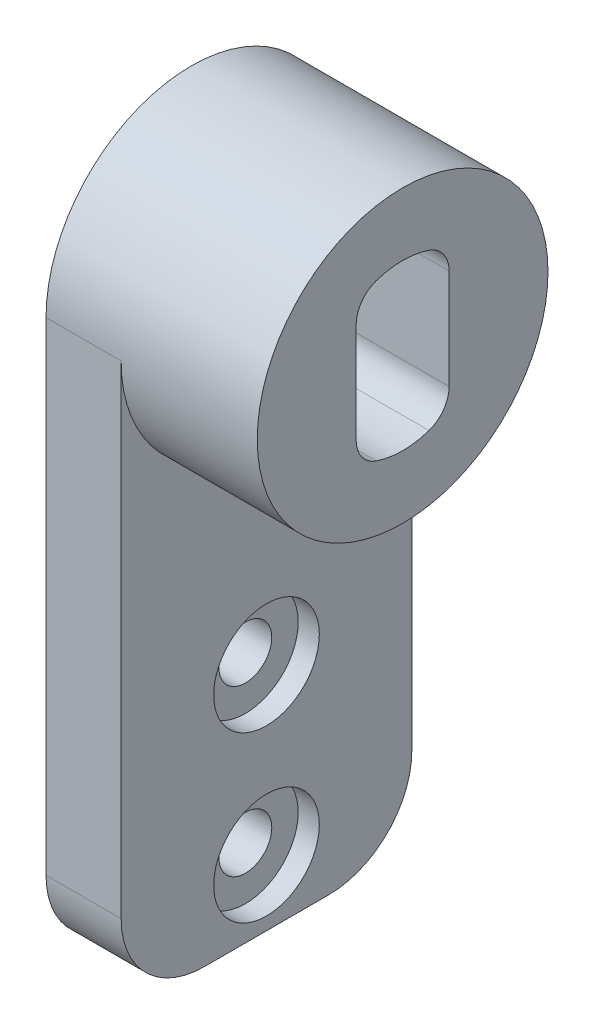
ISO-10303-21;
HEADER;
FILE_DESCRIPTION(('STEP AP214'),'2;1');
FILE_NAME('part.step','',(''),(''),'','','');
FILE_SCHEMA(('AUTOMOTIVE_DESIGN { 1 0 10303 214 1 1 1 1 }'));
ENDSEC;
DATA;
#1=APPLICATION_CONTEXT('core data for automotive mechanical design processes');
#2=APPLICATION_PROTOCOL_DEFINITION('international standard','automotive_design',2000,#1);
#3=PRODUCT_CONTEXT('',#1,'mechanical');
#4=PRODUCT('Part','Part','',(#3));
#5=PRODUCT_RELATED_PRODUCT_CATEGORY('part','',(#4));
#6=PRODUCT_DEFINITION_FORMATION('','',#4);
#7=PRODUCT_DEFINITION_CONTEXT('part definition',#1,'design');
#8=PRODUCT_DEFINITION('design','',#6,#7);
#9=PRODUCT_DEFINITION_SHAPE('','',#8);
#10=(LENGTH_UNIT() NAMED_UNIT(*) SI_UNIT(.MILLI.,.METRE.));
#11=(NAMED_UNIT(*) PLANE_ANGLE_UNIT() SI_UNIT($,.RADIAN.));
#12=(NAMED_UNIT(*) SI_UNIT($,.STERADIAN.) SOLID_ANGLE_UNIT());
#13=UNCERTAINTY_MEASURE_WITH_UNIT(LENGTH_MEASURE(1.E-05),#10,'distance_accuracy_value','');
#14=(GEOMETRIC_REPRESENTATION_CONTEXT(3) GLOBAL_UNCERTAINTY_ASSIGNED_CONTEXT((#13)) GLOBAL_UNIT_ASSIGNED_CONTEXT((#10,
#11,#12)) REPRESENTATION_CONTEXT('',''));
#15=CARTESIAN_POINT('',(0.,0.,0.));
#16=DIRECTION('',(0.,0.,1.));
#17=DIRECTION('',(1.,0.,0.));
#18=AXIS2_PLACEMENT_3D('',#15,#16,#17);
#19=CARTESIAN_POINT('',(12.7,-30.0897103576115,0.));
#20=DIRECTION('',(-1.,0.,0.));
#21=DIRECTION('',(0.,0.,1.));
#22=AXIS2_PLACEMENT_3D('',#19,#20,#21);
#23=CYLINDRICAL_SURFACE('',#22,1.5875);
#24=CARTESIAN_POINT('',(0.,-30.0897103576115,0.));
#25=DIRECTION('',(-1.,0.,0.));
#26=DIRECTION('',(0.,0.,1.));
#27=AXIS2_PLACEMENT_3D('',#24,#25,#26);
#28=CIRCLE('',#27,1.5875);
#29=CARTESIAN_POINT('',(0.,-30.0897103576115,1.5875));
#30=VERTEX_POINT('',#29);
#31=EDGE_CURVE('E220',#30,#30,#28,.T.);
#32=ORIENTED_EDGE('',*,*,#31,.T.);
#33=EDGE_LOOP('',(#32));
#34=FACE_BOUND('',#33,.T.);
#35=CARTESIAN_POINT('',(3.246000112,-30.0897103576115,0.));
#36=DIRECTION('',(1.,0.,0.));
#37=DIRECTION('',(0.,0.,-1.));
#38=AXIS2_PLACEMENT_3D('',#35,#36,#37);
#39=CIRCLE('',#38,1.5875);
#40=CARTESIAN_POINT('',(3.246000112,-30.0897103576115,-1.5875));
#41=VERTEX_POINT('',#40);
#42=EDGE_CURVE('E216',#41,#41,#39,.F.);
#43=ORIENTED_EDGE('',*,*,#42,.F.);
#44=EDGE_LOOP('',(#43));
#45=FACE_BOUND('',#44,.T.);
#46=ADVANCED_FACE('F49',(#34,#45),#23,.F.);
#47=CARTESIAN_POINT('',(12.7,-20.1843484056115,0.));
#48=DIRECTION('',(-1.,0.,0.));
#49=DIRECTION('',(0.,0.,1.));
#50=AXIS2_PLACEMENT_3D('',#47,#48,#49);
#51=CYLINDRICAL_SURFACE('',#50,1.5875);
#52=CARTESIAN_POINT('',(0.,-20.1843484056115,0.));
#53=DIRECTION('',(-1.,0.,0.));
#54=DIRECTION('',(0.,0.,1.));
#55=AXIS2_PLACEMENT_3D('',#52,#53,#54);
#56=CIRCLE('',#55,1.5875);
#57=CARTESIAN_POINT('',(0.,-20.1843484056115,1.5875));
#58=VERTEX_POINT('',#57);
#59=EDGE_CURVE('E283',#58,#58,#56,.T.);
#60=ORIENTED_EDGE('',*,*,#59,.T.);
#61=EDGE_LOOP('',(#60));
#62=FACE_BOUND('',#61,.T.);
#63=CARTESIAN_POINT('',(3.246000112,-20.1843484056115,0.));
#64=DIRECTION('',(1.,0.,0.));
#65=DIRECTION('',(0.,0.,-1.));
#66=AXIS2_PLACEMENT_3D('',#63,#64,#65);
#67=CIRCLE('',#66,1.5875);
#68=CARTESIAN_POINT('',(3.246000112,-20.1843484056115,-1.5875));
#69=VERTEX_POINT('',#68);
#70=EDGE_CURVE('E580',#69,#69,#67,.T.);
#71=ORIENTED_EDGE('',*,*,#70,.T.);
#72=EDGE_LOOP('',(#71));
#73=FACE_BOUND('',#72,.T.);
#74=ADVANCED_FACE('F362',(#62,#73),#51,.F.);
#75=CARTESIAN_POINT('',(12.7,0.,0.));
#76=DIRECTION('',(-1.,0.,0.));
#77=DIRECTION('',(0.,0.,1.));
#78=AXIS2_PLACEMENT_3D('',#75,#76,#77);
#79=CYLINDRICAL_SURFACE('',#78,8.7376);
#80=CARTESIAN_POINT('',(4.516000112,0.,0.));
#81=DIRECTION('',(-1.,0.,0.));
#82=DIRECTION('',(0.,0.,1.));
#83=AXIS2_PLACEMENT_3D('',#80,#81,#82);
#84=CIRCLE('',#83,8.7376);
#85=CARTESIAN_POINT('',(4.516000112,0.,-8.7376));
#86=VERTEX_POINT('',#85);
#87=CARTESIAN_POINT('',(4.516000112,0.,8.7376));
#88=VERTEX_POINT('',#87);
#89=EDGE_CURVE('E179',#86,#88,#84,.T.);
#90=ORIENTED_EDGE('',*,*,#89,.F.);
#91=DIRECTION('',(-1.,0.,0.));
#92=VECTOR('',#91,1.);
#93=CARTESIAN_POINT('',(4.516000112,0.,-8.7376));
#94=LINE('',#93,#92);
#95=CARTESIAN_POINT('',(0.,0.,-8.7376));
#96=VERTEX_POINT('',#95);
#97=EDGE_CURVE('E156',#86,#96,#94,.T.);
#98=ORIENTED_EDGE('',*,*,#97,.T.);
#99=CARTESIAN_POINT('',(0.,0.,0.));
#100=DIRECTION('',(1.,0.,0.));
#101=DIRECTION('',(0.,0.,-1.));
#102=AXIS2_PLACEMENT_3D('',#99,#100,#101);
#103=CIRCLE('',#102,8.7376);
#104=CARTESIAN_POINT('',(0.,0.,8.7376));
#105=VERTEX_POINT('',#104);
#106=EDGE_CURVE('E165',#96,#105,#103,.T.);
#107=ORIENTED_EDGE('',*,*,#106,.T.);
#108=DIRECTION('',(-1.,0.,0.));
#109=VECTOR('',#108,1.);
#110=CARTESIAN_POINT('',(4.516000112,0.,8.7376));
#111=LINE('',#110,#109);
#112=EDGE_CURVE('E181',#88,#105,#111,.T.);
#113=ORIENTED_EDGE('',*,*,#112,.F.);
#114=EDGE_LOOP('',(#90,#98,#107,#113));
#115=FACE_BOUND('',#114,.T.);
#116=CARTESIAN_POINT('',(12.7,0.,0.));
#117=DIRECTION('',(1.,0.,0.));
#118=DIRECTION('',(0.,0.,-1.));
#119=AXIS2_PLACEMENT_3D('',#116,#117,#118);
#120=CIRCLE('',#119,8.7376);
#121=CARTESIAN_POINT('',(12.7,0.,-8.7376));
#122=VERTEX_POINT('',#121);
#123=EDGE_CURVE('E173',#122,#122,#120,.T.);
#124=ORIENTED_EDGE('',*,*,#123,.F.);
#125=EDGE_LOOP('',(#124));
#126=FACE_BOUND('',#125,.T.);
#127=ADVANCED_FACE('F176',(#115,#126),#79,.T.);
#128=CARTESIAN_POINT('',(12.7,0.,0.));
#129=DIRECTION('',(1.,0.,0.));
#130=DIRECTION('',(0.,0.,-1.));
#131=AXIS2_PLACEMENT_3D('',#128,#129,#130);
#132=PLANE('',#131);
#133=CARTESIAN_POINT('',(12.7,0.,0.));
#134=DIRECTION('',(1.,0.,0.));
#135=DIRECTION('',(0.,0.,-1.));
#136=AXIS2_PLACEMENT_3D('',#133,#134,#135);
#137=CIRCLE('',#136,4.953);
#138=CARTESIAN_POINT('',(12.7,4.69255908842926,-1.58496));
#139=VERTEX_POINT('',#138);
#140=CARTESIAN_POINT('',(12.7,4.69255908842926,1.58496));
#141=VERTEX_POINT('',#140);
#142=EDGE_CURVE('E271',#139,#141,#137,.T.);
#143=ORIENTED_EDGE('',*,*,#142,.F.);
#144=CARTESIAN_POINT('',(12.7,3.00805069771106,-1.016));
#145=DIRECTION('',(1.,0.,0.));
#146=DIRECTION('',(0.,0.,-1.));
#147=AXIS2_PLACEMENT_3D('',#144,#145,#146);
#148=CIRCLE('',#147,1.778);
#149=CARTESIAN_POINT('',(12.7,3.00805069771106,-2.794));
#150=VERTEX_POINT('',#149);
#151=EDGE_CURVE('E260',#139,#150,#148,.F.);
#152=ORIENTED_EDGE('',*,*,#151,.T.);
#153=DIRECTION('',(0.,1.,0.));
#154=VECTOR('',#153,1.);
#155=CARTESIAN_POINT('',(12.7,-4.08971551577857,-2.794));
#156=LINE('',#155,#154);
#157=CARTESIAN_POINT('',(12.7,-3.00805069771106,-2.794));
#158=VERTEX_POINT('',#157);
#159=EDGE_CURVE('E304',#158,#150,#156,.T.);
#160=ORIENTED_EDGE('',*,*,#159,.F.);
#161=CARTESIAN_POINT('',(12.7,-3.00805069771106,-1.016));
#162=DIRECTION('',(1.,0.,0.));
#163=DIRECTION('',(0.,0.,-1.));
#164=AXIS2_PLACEMENT_3D('',#161,#162,#163);
#165=CIRCLE('',#164,1.778);
#166=CARTESIAN_POINT('',(12.7,-4.69255908842926,-1.58496));
#167=VERTEX_POINT('',#166);
#168=EDGE_CURVE('E58',#158,#167,#165,.F.);
#169=ORIENTED_EDGE('',*,*,#168,.T.);
#170=CARTESIAN_POINT('',(12.7,0.,0.));
#171=DIRECTION('',(1.,0.,0.));
#172=DIRECTION('',(0.,0.,-1.));
#173=AXIS2_PLACEMENT_3D('',#170,#171,#172);
#174=CIRCLE('',#173,4.953);
#175=CARTESIAN_POINT('',(12.7,-4.69255908842926,1.58496));
#176=VERTEX_POINT('',#175);
#177=EDGE_CURVE('E312',#176,#167,#174,.T.);
#178=ORIENTED_EDGE('',*,*,#177,.F.);
#179=CARTESIAN_POINT('',(12.7,-3.00805069771106,1.016));
#180=DIRECTION('',(1.,0.,0.));
#181=DIRECTION('',(0.,0.,-1.));
#182=AXIS2_PLACEMENT_3D('',#179,#180,#181);
#183=CIRCLE('',#182,1.778);
#184=CARTESIAN_POINT('',(12.7,-3.00805069771106,2.794));
#185=VERTEX_POINT('',#184);
#186=EDGE_CURVE('E11',#176,#185,#183,.F.);
#187=ORIENTED_EDGE('',*,*,#186,.T.);
#188=DIRECTION('',(0.,-1.,0.));
#189=VECTOR('',#188,1.);
#190=CARTESIAN_POINT('',(12.7,-4.08971551577857,2.794));
#191=LINE('',#190,#189);
#192=CARTESIAN_POINT('',(12.7,3.00805069771106,2.794));
#193=VERTEX_POINT('',#192);
#194=EDGE_CURVE('E273',#193,#185,#191,.T.);
#195=ORIENTED_EDGE('',*,*,#194,.F.);
#196=CARTESIAN_POINT('',(12.7,3.00805069771106,1.016));
#197=DIRECTION('',(1.,0.,0.));
#198=DIRECTION('',(0.,0.,-1.));
#199=AXIS2_PLACEMENT_3D('',#196,#197,#198);
#200=CIRCLE('',#199,1.778);
#201=EDGE_CURVE('E263',#193,#141,#200,.F.);
#202=ORIENTED_EDGE('',*,*,#201,.T.);
#203=EDGE_LOOP('',(#143,#152,#160,#169,#178,#187,#195,#202));
#204=FACE_BOUND('',#203,.T.);
#205=ORIENTED_EDGE('',*,*,#123,.T.);
#206=EDGE_LOOP('',(#205));
#207=FACE_BOUND('',#206,.T.);
#208=ADVANCED_FACE('F269',(#204,#207),#132,.T.);
#209=CARTESIAN_POINT('',(0.,0.,0.));
#210=DIRECTION('',(1.,0.,0.));
#211=DIRECTION('',(0.,0.,-1.));
#212=AXIS2_PLACEMENT_3D('',#209,#210,#211);
#213=PLANE('',#212);
#214=ORIENTED_EDGE('',*,*,#59,.F.);
#215=EDGE_LOOP('',(#214));
#216=FACE_BOUND('',#215,.T.);
#217=ORIENTED_EDGE('',*,*,#31,.F.);
#218=EDGE_LOOP('',(#217));
#219=FACE_BOUND('',#218,.T.);
#220=DIRECTION('',(0.,0.,-1.));
#221=VECTOR('',#220,1.);
#222=CARTESIAN_POINT('',(0.,-34.036,0.));
#223=LINE('',#222,#221);
#224=CARTESIAN_POINT('',(0.,-34.036,3.7376));
#225=VERTEX_POINT('',#224);
#226=CARTESIAN_POINT('',(0.,-34.036,-3.7376));
#227=VERTEX_POINT('',#226);
#228=EDGE_CURVE('E161',#225,#227,#223,.T.);
#229=ORIENTED_EDGE('',*,*,#228,.F.);
#230=CARTESIAN_POINT('',(0.,-29.036,3.7376));
#231=DIRECTION('',(1.,0.,0.));
#232=DIRECTION('',(0.,0.,-1.));
#233=AXIS2_PLACEMENT_3D('',#230,#231,#232);
#234=CIRCLE('',#233,5.);
#235=CARTESIAN_POINT('',(0.,-29.036,8.7376));
#236=VERTEX_POINT('',#235);
#237=EDGE_CURVE('E201',#225,#236,#234,.F.);
#238=ORIENTED_EDGE('',*,*,#237,.T.);
#239=DIRECTION('',(0.,-1.,0.));
#240=VECTOR('',#239,1.);
#241=CARTESIAN_POINT('',(0.,0.,8.7376));
#242=LINE('',#241,#240);
#243=EDGE_CURVE('E169',#105,#236,#242,.T.);
#244=ORIENTED_EDGE('',*,*,#243,.F.);
#245=ORIENTED_EDGE('',*,*,#106,.F.);
#246=DIRECTION('',(0.,1.,0.));
#247=VECTOR('',#246,1.);
#248=CARTESIAN_POINT('',(0.,0.,-8.7376));
#249=LINE('',#248,#247);
#250=CARTESIAN_POINT('',(0.,-29.036,-8.7376));
#251=VERTEX_POINT('',#250);
#252=EDGE_CURVE('E151',#251,#96,#249,.T.);
#253=ORIENTED_EDGE('',*,*,#252,.F.);
#254=CARTESIAN_POINT('',(0.,-29.036,-3.7376));
#255=DIRECTION('',(1.,0.,0.));
#256=DIRECTION('',(0.,0.,-1.));
#257=AXIS2_PLACEMENT_3D('',#254,#255,#256);
#258=CIRCLE('',#257,5.);
#259=EDGE_CURVE('E198',#251,#227,#258,.F.);
#260=ORIENTED_EDGE('',*,*,#259,.T.);
#261=EDGE_LOOP('',(#229,#238,#244,#245,#253,#260));
#262=FACE_BOUND('',#261,.T.);
#263=ADVANCED_FACE('F167',(#216,#219,#262),#213,.F.);
#264=CARTESIAN_POINT('',(4.516000112,0.,-8.7376));
#265=DIRECTION('',(0.,0.,1.));
#266=DIRECTION('',(0.,-1.,0.));
#267=AXIS2_PLACEMENT_3D('',#264,#265,#266);
#268=PLANE('',#267);
#269=DIRECTION('',(0.,1.,0.));
#270=VECTOR('',#269,1.);
#271=CARTESIAN_POINT('',(4.516000112,0.,-8.7376));
#272=LINE('',#271,#270);
#273=CARTESIAN_POINT('',(4.516000112,-29.036,-8.7376));
#274=VERTEX_POINT('',#273);
#275=EDGE_CURVE('E318',#274,#86,#272,.T.);
#276=ORIENTED_EDGE('',*,*,#275,.F.);
#277=DIRECTION('',(-1.,0.,0.));
#278=VECTOR('',#277,1.);
#279=CARTESIAN_POINT('',(4.516000112,-29.036,-8.7376));
#280=LINE('',#279,#278);
#281=EDGE_CURVE('E158',#274,#251,#280,.T.);
#282=ORIENTED_EDGE('',*,*,#281,.T.);
#283=ORIENTED_EDGE('',*,*,#252,.T.);
#284=ORIENTED_EDGE('',*,*,#97,.F.);
#285=EDGE_LOOP('',(#276,#282,#283,#284));
#286=FACE_BOUND('',#285,.T.);
#287=ADVANCED_FACE('F154',(#286),#268,.F.);
#288=CARTESIAN_POINT('',(4.516000112,0.,8.7376));
#289=DIRECTION('',(0.,0.,-1.));
#290=DIRECTION('',(0.,1.,0.));
#291=AXIS2_PLACEMENT_3D('',#288,#289,#290);
#292=PLANE('',#291);
#293=ORIENTED_EDGE('',*,*,#243,.T.);
#294=DIRECTION('',(-1.,0.,0.));
#295=VECTOR('',#294,1.);
#296=CARTESIAN_POINT('',(4.516000112,-29.036,8.7376));
#297=LINE('',#296,#295);
#298=CARTESIAN_POINT('',(4.516000112,-29.036,8.7376));
#299=VERTEX_POINT('',#298);
#300=EDGE_CURVE('E204',#236,#299,#297,.F.);
#301=ORIENTED_EDGE('',*,*,#300,.T.);
#302=DIRECTION('',(0.,-1.,0.));
#303=VECTOR('',#302,1.);
#304=CARTESIAN_POINT('',(4.516000112,0.,8.7376));
#305=LINE('',#304,#303);
#306=EDGE_CURVE('E325',#88,#299,#305,.T.);
#307=ORIENTED_EDGE('',*,*,#306,.F.);
#308=ORIENTED_EDGE('',*,*,#112,.T.);
#309=EDGE_LOOP('',(#293,#301,#307,#308));
#310=FACE_BOUND('',#309,.T.);
#311=ADVANCED_FACE('F337',(#310),#292,.F.);
#312=CARTESIAN_POINT('',(4.516000112,-34.036,0.));
#313=DIRECTION('',(0.,1.,0.));
#314=DIRECTION('',(0.,0.,1.));
#315=AXIS2_PLACEMENT_3D('',#312,#313,#314);
#316=PLANE('',#315);
#317=DIRECTION('',(0.,0.,-1.));
#318=VECTOR('',#317,1.);
#319=CARTESIAN_POINT('',(4.516000112,-34.036,0.));
#320=LINE('',#319,#318);
#321=CARTESIAN_POINT('',(4.516000112,-34.036,3.7376));
#322=VERTEX_POINT('',#321);
#323=CARTESIAN_POINT('',(4.516000112,-34.036,-3.7376));
#324=VERTEX_POINT('',#323);
#325=EDGE_CURVE('E321',#322,#324,#320,.T.);
#326=ORIENTED_EDGE('',*,*,#325,.F.);
#327=DIRECTION('',(-1.,0.,0.));
#328=VECTOR('',#327,1.);
#329=CARTESIAN_POINT('',(4.516000112,-34.036,3.7376));
#330=LINE('',#329,#328);
#331=EDGE_CURVE('E194',#322,#225,#330,.T.);
#332=ORIENTED_EDGE('',*,*,#331,.T.);
#333=ORIENTED_EDGE('',*,*,#228,.T.);
#334=DIRECTION('',(-1.,0.,0.));
#335=VECTOR('',#334,1.);
#336=CARTESIAN_POINT('',(4.516000112,-34.036,-3.7376));
#337=LINE('',#336,#335);
#338=EDGE_CURVE('E190',#227,#324,#337,.F.);
#339=ORIENTED_EDGE('',*,*,#338,.T.);
#340=EDGE_LOOP('',(#326,#332,#333,#339));
#341=FACE_BOUND('',#340,.T.);
#342=ADVANCED_FACE('F347',(#341),#316,.F.);
#343=CARTESIAN_POINT('',(4.516000112,0.,0.));
#344=DIRECTION('',(-1.,0.,0.));
#345=DIRECTION('',(0.,0.,1.));
#346=AXIS2_PLACEMENT_3D('',#343,#344,#345);
#347=PLANE('',#346);
#348=CARTESIAN_POINT('',(4.516000112,-20.1843484056115,0.));
#349=DIRECTION('',(1.,0.,0.));
#350=DIRECTION('',(0.,0.,-1.));
#351=AXIS2_PLACEMENT_3D('',#348,#349,#350);
#352=CIRCLE('',#351,3.175);
#353=CARTESIAN_POINT('',(4.516000112,-20.1843484056115,-3.175));
#354=VERTEX_POINT('',#353);
#355=EDGE_CURVE('E585',#354,#354,#352,.T.);
#356=ORIENTED_EDGE('',*,*,#355,.F.);
#357=EDGE_LOOP('',(#356));
#358=FACE_BOUND('',#357,.T.);
#359=CARTESIAN_POINT('',(4.516000112,-30.0897103576115,0.));
#360=DIRECTION('',(1.,0.,0.));
#361=DIRECTION('',(0.,0.,-1.));
#362=AXIS2_PLACEMENT_3D('',#359,#360,#361);
#363=CIRCLE('',#362,3.175);
#364=CARTESIAN_POINT('',(4.516000112,-30.0897103576115,-3.175));
#365=VERTEX_POINT('',#364);
#366=EDGE_CURVE('E577',#365,#365,#363,.T.);
#367=ORIENTED_EDGE('',*,*,#366,.F.);
#368=EDGE_LOOP('',(#367));
#369=FACE_BOUND('',#368,.T.);
#370=ORIENTED_EDGE('',*,*,#306,.T.);
#371=CARTESIAN_POINT('',(4.516000112,-29.036,3.7376));
#372=DIRECTION('',(-1.,0.,0.));
#373=DIRECTION('',(0.,0.,1.));
#374=AXIS2_PLACEMENT_3D('',#371,#372,#373);
#375=CIRCLE('',#374,5.);
#376=EDGE_CURVE('E210',#299,#322,#375,.F.);
#377=ORIENTED_EDGE('',*,*,#376,.T.);
#378=ORIENTED_EDGE('',*,*,#325,.T.);
#379=CARTESIAN_POINT('',(4.516000112,-29.036,-3.7376));
#380=DIRECTION('',(-1.,0.,0.));
#381=DIRECTION('',(0.,0.,1.));
#382=AXIS2_PLACEMENT_3D('',#379,#380,#381);
#383=CIRCLE('',#382,5.);
#384=EDGE_CURVE('E207',#324,#274,#383,.F.);
#385=ORIENTED_EDGE('',*,*,#384,.T.);
#386=ORIENTED_EDGE('',*,*,#275,.T.);
#387=ORIENTED_EDGE('',*,*,#89,.T.);
#388=EDGE_LOOP('',(#370,#377,#378,#385,#386,#387));
#389=FACE_BOUND('',#388,.T.);
#390=ADVANCED_FACE('F345',(#358,#369,#389),#347,.F.);
#391=CARTESIAN_POINT('',(4.516000112,-29.036,3.7376));
#392=DIRECTION('',(-1.,0.,0.));
#393=DIRECTION('',(0.,0.,1.));
#394=AXIS2_PLACEMENT_3D('',#391,#392,#393);
#395=CYLINDRICAL_SURFACE('',#394,5.);
#396=ORIENTED_EDGE('',*,*,#376,.F.);
#397=ORIENTED_EDGE('',*,*,#300,.F.);
#398=ORIENTED_EDGE('',*,*,#237,.F.);
#399=ORIENTED_EDGE('',*,*,#331,.F.);
#400=EDGE_LOOP('',(#396,#397,#398,#399));
#401=FACE_BOUND('',#400,.T.);
#402=ADVANCED_FACE('F341',(#401),#395,.T.);
#403=CARTESIAN_POINT('',(4.516000112,-29.036,-3.7376));
#404=DIRECTION('',(-1.,0.,0.));
#405=DIRECTION('',(0.,0.,1.));
#406=AXIS2_PLACEMENT_3D('',#403,#404,#405);
#407=CYLINDRICAL_SURFACE('',#406,5.);
#408=ORIENTED_EDGE('',*,*,#384,.F.);
#409=ORIENTED_EDGE('',*,*,#338,.F.);
#410=ORIENTED_EDGE('',*,*,#259,.F.);
#411=ORIENTED_EDGE('',*,*,#281,.F.);
#412=EDGE_LOOP('',(#408,#409,#410,#411));
#413=FACE_BOUND('',#412,.T.);
#414=ADVANCED_FACE('F349',(#413),#407,.T.);
#415=CARTESIAN_POINT('',(0.508,0.,0.));
#416=DIRECTION('',(1.,0.,0.));
#417=DIRECTION('',(0.,0.,-1.));
#418=AXIS2_PLACEMENT_3D('',#415,#416,#417);
#419=CYLINDRICAL_SURFACE('',#418,4.953);
#420=CARTESIAN_POINT('',(0.508,0.,0.));
#421=DIRECTION('',(1.,0.,0.));
#422=DIRECTION('',(0.,0.,-1.));
#423=AXIS2_PLACEMENT_3D('',#420,#421,#422);
#424=CIRCLE('',#423,4.953);
#425=CARTESIAN_POINT('',(0.508,4.69255908842926,-1.58496));
#426=VERTEX_POINT('',#425);
#427=CARTESIAN_POINT('',(0.508,4.69255908842926,1.58496));
#428=VERTEX_POINT('',#427);
#429=EDGE_CURVE('E294',#426,#428,#424,.T.);
#430=ORIENTED_EDGE('',*,*,#429,.F.);
#431=DIRECTION('',(1.,0.,0.));
#432=VECTOR('',#431,1.);
#433=CARTESIAN_POINT('',(0.508,4.69255908842926,-1.58496));
#434=LINE('',#433,#432);
#435=EDGE_CURVE('E224',#426,#139,#434,.T.);
#436=ORIENTED_EDGE('',*,*,#435,.T.);
#437=ORIENTED_EDGE('',*,*,#142,.T.);
#438=DIRECTION('',(1.,0.,0.));
#439=VECTOR('',#438,1.);
#440=CARTESIAN_POINT('',(0.508,4.69255908842926,1.58496));
#441=LINE('',#440,#439);
#442=EDGE_CURVE('E215',#141,#428,#441,.F.);
#443=ORIENTED_EDGE('',*,*,#442,.T.);
#444=EDGE_LOOP('',(#430,#436,#437,#443));
#445=FACE_BOUND('',#444,.T.);
#446=ADVANCED_FACE('F279',(#445),#419,.F.);
#447=CARTESIAN_POINT('',(0.508,-4.08971551577857,-2.794));
#448=DIRECTION('',(0.,0.,-1.));
#449=DIRECTION('',(-1.,0.,0.));
#450=AXIS2_PLACEMENT_3D('',#447,#448,#449);
#451=PLANE('',#450);
#452=ORIENTED_EDGE('',*,*,#159,.T.);
#453=DIRECTION('',(-1.,0.,0.));
#454=VECTOR('',#453,1.);
#455=CARTESIAN_POINT('',(0.508,3.00805069771106,-2.794));
#456=LINE('',#455,#454);
#457=CARTESIAN_POINT('',(0.508,3.00805069771106,-2.794));
#458=VERTEX_POINT('',#457);
#459=EDGE_CURVE('E232',#150,#458,#456,.T.);
#460=ORIENTED_EDGE('',*,*,#459,.T.);
#461=DIRECTION('',(0.,1.,0.));
#462=VECTOR('',#461,1.);
#463=CARTESIAN_POINT('',(0.508,-4.08971551577857,-2.794));
#464=LINE('',#463,#462);
#465=CARTESIAN_POINT('',(0.508,-3.00805069771106,-2.794));
#466=VERTEX_POINT('',#465);
#467=EDGE_CURVE('E162',#466,#458,#464,.T.);
#468=ORIENTED_EDGE('',*,*,#467,.F.);
#469=DIRECTION('',(-1.,0.,0.));
#470=VECTOR('',#469,1.);
#471=CARTESIAN_POINT('',(12.7,-3.00805069771106,-2.794));
#472=LINE('',#471,#470);
#473=EDGE_CURVE('E228',#466,#158,#472,.F.);
#474=ORIENTED_EDGE('',*,*,#473,.T.);
#475=EDGE_LOOP('',(#452,#460,#468,#474));
#476=FACE_BOUND('',#475,.T.);
#477=ADVANCED_FACE('F357',(#476),#451,.F.);
#478=CARTESIAN_POINT('',(0.508,0.,0.));
#479=DIRECTION('',(1.,0.,0.));
#480=DIRECTION('',(0.,0.,-1.));
#481=AXIS2_PLACEMENT_3D('',#478,#479,#480);
#482=CYLINDRICAL_SURFACE('',#481,4.953);
#483=ORIENTED_EDGE('',*,*,#177,.T.);
#484=DIRECTION('',(1.,0.,0.));
#485=VECTOR('',#484,1.);
#486=CARTESIAN_POINT('',(0.508,-4.69255908842926,-1.58496));
#487=LINE('',#486,#485);
#488=CARTESIAN_POINT('',(0.508,-4.69255908842926,-1.58496));
#489=VERTEX_POINT('',#488);
#490=EDGE_CURVE('E257',#167,#489,#487,.F.);
#491=ORIENTED_EDGE('',*,*,#490,.T.);
#492=CARTESIAN_POINT('',(0.508,0.,0.));
#493=DIRECTION('',(1.,0.,0.));
#494=DIRECTION('',(0.,0.,-1.));
#495=AXIS2_PLACEMENT_3D('',#492,#493,#494);
#496=CIRCLE('',#495,4.953);
#497=CARTESIAN_POINT('',(0.508,-4.69255908842926,1.58496));
#498=VERTEX_POINT('',#497);
#499=EDGE_CURVE('E298',#498,#489,#496,.T.);
#500=ORIENTED_EDGE('',*,*,#499,.F.);
#501=DIRECTION('',(1.,0.,0.));
#502=VECTOR('',#501,1.);
#503=CARTESIAN_POINT('',(0.508,-4.69255908842926,1.58496));
#504=LINE('',#503,#502);
#505=EDGE_CURVE('E254',#498,#176,#504,.T.);
#506=ORIENTED_EDGE('',*,*,#505,.T.);
#507=EDGE_LOOP('',(#483,#491,#500,#506));
#508=FACE_BOUND('',#507,.T.);
#509=ADVANCED_FACE('F379',(#508),#482,.F.);
#510=CARTESIAN_POINT('',(0.508,-4.08971551577857,2.794));
#511=DIRECTION('',(0.,0.,1.));
#512=DIRECTION('',(1.,0.,0.));
#513=AXIS2_PLACEMENT_3D('',#510,#511,#512);
#514=PLANE('',#513);
#515=DIRECTION('',(0.,-1.,0.));
#516=VECTOR('',#515,1.);
#517=CARTESIAN_POINT('',(0.508,-4.08971551577857,2.794));
#518=LINE('',#517,#516);
#519=CARTESIAN_POINT('',(0.508,3.00805069771106,2.794));
#520=VERTEX_POINT('',#519);
#521=CARTESIAN_POINT('',(0.508,-3.00805069771106,2.794));
#522=VERTEX_POINT('',#521);
#523=EDGE_CURVE('E292',#520,#522,#518,.T.);
#524=ORIENTED_EDGE('',*,*,#523,.F.);
#525=DIRECTION('',(-1.,0.,0.));
#526=VECTOR('',#525,1.);
#527=CARTESIAN_POINT('',(12.7,3.00805069771106,2.794));
#528=LINE('',#527,#526);
#529=EDGE_CURVE('E250',#520,#193,#528,.F.);
#530=ORIENTED_EDGE('',*,*,#529,.T.);
#531=ORIENTED_EDGE('',*,*,#194,.T.);
#532=DIRECTION('',(-1.,0.,0.));
#533=VECTOR('',#532,1.);
#534=CARTESIAN_POINT('',(0.508,-3.00805069771106,2.794));
#535=LINE('',#534,#533);
#536=EDGE_CURVE('E247',#185,#522,#535,.T.);
#537=ORIENTED_EDGE('',*,*,#536,.T.);
#538=EDGE_LOOP('',(#524,#530,#531,#537));
#539=FACE_BOUND('',#538,.T.);
#540=ADVANCED_FACE('F296',(#539),#514,.F.);
#541=CARTESIAN_POINT('',(0.508,0.,0.));
#542=DIRECTION('',(1.,0.,0.));
#543=DIRECTION('',(0.,0.,-1.));
#544=AXIS2_PLACEMENT_3D('',#541,#542,#543);
#545=PLANE('',#544);
#546=ORIENTED_EDGE('',*,*,#467,.T.);
#547=CARTESIAN_POINT('',(0.508,3.00805069771106,-1.016));
#548=DIRECTION('',(1.,0.,0.));
#549=DIRECTION('',(0.,0.,-1.));
#550=AXIS2_PLACEMENT_3D('',#547,#548,#549);
#551=CIRCLE('',#550,1.778);
#552=EDGE_CURVE('E244',#458,#426,#551,.T.);
#553=ORIENTED_EDGE('',*,*,#552,.T.);
#554=ORIENTED_EDGE('',*,*,#429,.T.);
#555=CARTESIAN_POINT('',(0.508,3.00805069771106,1.016));
#556=DIRECTION('',(1.,0.,0.));
#557=DIRECTION('',(0.,0.,-1.));
#558=AXIS2_PLACEMENT_3D('',#555,#556,#557);
#559=CIRCLE('',#558,1.778);
#560=EDGE_CURVE('E241',#428,#520,#559,.T.);
#561=ORIENTED_EDGE('',*,*,#560,.T.);
#562=ORIENTED_EDGE('',*,*,#523,.T.);
#563=CARTESIAN_POINT('',(0.508,-3.00805069771106,1.016));
#564=DIRECTION('',(1.,0.,0.));
#565=DIRECTION('',(0.,0.,-1.));
#566=AXIS2_PLACEMENT_3D('',#563,#564,#565);
#567=CIRCLE('',#566,1.778);
#568=EDGE_CURVE('E235',#522,#498,#567,.T.);
#569=ORIENTED_EDGE('',*,*,#568,.T.);
#570=ORIENTED_EDGE('',*,*,#499,.T.);
#571=CARTESIAN_POINT('',(0.508,-3.00805069771106,-1.016));
#572=DIRECTION('',(1.,0.,0.));
#573=DIRECTION('',(0.,0.,-1.));
#574=AXIS2_PLACEMENT_3D('',#571,#572,#573);
#575=CIRCLE('',#574,1.778);
#576=EDGE_CURVE('E238',#489,#466,#575,.T.);
#577=ORIENTED_EDGE('',*,*,#576,.T.);
#578=EDGE_LOOP('',(#546,#553,#554,#561,#562,#569,#570,#577));
#579=FACE_BOUND('',#578,.T.);
#580=ADVANCED_FACE('F291',(#579),#545,.T.);
#581=CARTESIAN_POINT('',(3.246000112,-20.1843484056115,0.));
#582=DIRECTION('',(1.,0.,0.));
#583=DIRECTION('',(0.,0.,-1.));
#584=AXIS2_PLACEMENT_3D('',#581,#582,#583);
#585=CYLINDRICAL_SURFACE('',#584,3.175);
#586=CARTESIAN_POINT('',(3.246000112,-20.1843484056115,0.));
#587=DIRECTION('',(1.,0.,0.));
#588=DIRECTION('',(0.,0.,-1.));
#589=AXIS2_PLACEMENT_3D('',#586,#587,#588);
#590=CIRCLE('',#589,3.175);
#591=CARTESIAN_POINT('',(3.246000112,-20.1843484056115,-3.175));
#592=VERTEX_POINT('',#591);
#593=EDGE_CURVE('E221',#592,#592,#590,.T.);
#594=ORIENTED_EDGE('',*,*,#593,.F.);
#595=EDGE_LOOP('',(#594));
#596=FACE_BOUND('',#595,.T.);
#597=ORIENTED_EDGE('',*,*,#355,.T.);
#598=EDGE_LOOP('',(#597));
#599=FACE_BOUND('',#598,.T.);
#600=ADVANCED_FACE('F376',(#596,#599),#585,.F.);
#601=CARTESIAN_POINT('',(3.246000112,-20.1843484056115,0.));
#602=DIRECTION('',(1.,0.,0.));
#603=DIRECTION('',(0.,0.,-1.));
#604=AXIS2_PLACEMENT_3D('',#601,#602,#603);
#605=PLANE('',#604);
#606=ORIENTED_EDGE('',*,*,#70,.F.);
#607=EDGE_LOOP('',(#606));
#608=FACE_BOUND('',#607,.T.);
#609=ORIENTED_EDGE('',*,*,#593,.T.);
#610=EDGE_LOOP('',(#609));
#611=FACE_BOUND('',#610,.T.);
#612=ADVANCED_FACE('F482',(#608,#611),#605,.T.);
#613=CARTESIAN_POINT('',(3.246000112,-30.0897103576115,0.));
#614=DIRECTION('',(1.,0.,0.));
#615=DIRECTION('',(0.,0.,-1.));
#616=AXIS2_PLACEMENT_3D('',#613,#614,#615);
#617=PLANE('',#616);
#618=CARTESIAN_POINT('',(3.246000112,-30.0897103576115,0.));
#619=DIRECTION('',(1.,0.,0.));
#620=DIRECTION('',(0.,0.,-1.));
#621=AXIS2_PLACEMENT_3D('',#618,#619,#620);
#622=CIRCLE('',#621,3.175);
#623=CARTESIAN_POINT('',(3.246000112,-30.0897103576115,-3.175));
#624=VERTEX_POINT('',#623);
#625=EDGE_CURVE('E574',#624,#624,#622,.T.);
#626=ORIENTED_EDGE('',*,*,#625,.T.);
#627=EDGE_LOOP('',(#626));
#628=FACE_BOUND('',#627,.T.);
#629=ORIENTED_EDGE('',*,*,#42,.T.);
#630=EDGE_LOOP('',(#629));
#631=FACE_BOUND('',#630,.T.);
#632=ADVANCED_FACE('F492',(#628,#631),#617,.T.);
#633=CARTESIAN_POINT('',(3.246000112,-30.0897103576115,0.));
#634=DIRECTION('',(1.,0.,0.));
#635=DIRECTION('',(0.,0.,-1.));
#636=AXIS2_PLACEMENT_3D('',#633,#634,#635);
#637=CYLINDRICAL_SURFACE('',#636,3.175);
#638=ORIENTED_EDGE('',*,*,#625,.F.);
#639=EDGE_LOOP('',(#638));
#640=FACE_BOUND('',#639,.T.);
#641=ORIENTED_EDGE('',*,*,#366,.T.);
#642=EDGE_LOOP('',(#641));
#643=FACE_BOUND('',#642,.T.);
#644=ADVANCED_FACE('F502',(#640,#643),#637,.F.);
#645=CARTESIAN_POINT('',(0.508,3.00805069771106,-1.016));
#646=DIRECTION('',(1.,0.,0.));
#647=DIRECTION('',(0.,0.,-1.));
#648=AXIS2_PLACEMENT_3D('',#645,#646,#647);
#649=CYLINDRICAL_SURFACE('',#648,1.778);
#650=ORIENTED_EDGE('',*,*,#552,.F.);
#651=ORIENTED_EDGE('',*,*,#459,.F.);
#652=ORIENTED_EDGE('',*,*,#151,.F.);
#653=ORIENTED_EDGE('',*,*,#435,.F.);
#654=EDGE_LOOP('',(#650,#651,#652,#653));
#655=FACE_BOUND('',#654,.T.);
#656=ADVANCED_FACE('F511',(#655),#649,.F.);
#657=CARTESIAN_POINT('',(0.508,3.00805069771106,1.016));
#658=DIRECTION('',(1.,0.,0.));
#659=DIRECTION('',(0.,0.,-1.));
#660=AXIS2_PLACEMENT_3D('',#657,#658,#659);
#661=CYLINDRICAL_SURFACE('',#660,1.778);
#662=ORIENTED_EDGE('',*,*,#560,.F.);
#663=ORIENTED_EDGE('',*,*,#442,.F.);
#664=ORIENTED_EDGE('',*,*,#201,.F.);
#665=ORIENTED_EDGE('',*,*,#529,.F.);
#666=EDGE_LOOP('',(#662,#663,#664,#665));
#667=FACE_BOUND('',#666,.T.);
#668=ADVANCED_FACE('F286',(#667),#661,.F.);
#669=CARTESIAN_POINT('',(0.508,-3.00805069771106,-1.016));
#670=DIRECTION('',(1.,0.,0.));
#671=DIRECTION('',(0.,0.,-1.));
#672=AXIS2_PLACEMENT_3D('',#669,#670,#671);
#673=CYLINDRICAL_SURFACE('',#672,1.778);
#674=ORIENTED_EDGE('',*,*,#576,.F.);
#675=ORIENTED_EDGE('',*,*,#490,.F.);
#676=ORIENTED_EDGE('',*,*,#168,.F.);
#677=ORIENTED_EDGE('',*,*,#473,.F.);
#678=EDGE_LOOP('',(#674,#675,#676,#677));
#679=FACE_BOUND('',#678,.T.);
#680=ADVANCED_FACE('F528',(#679),#673,.F.);
#681=CARTESIAN_POINT('',(0.508,-3.00805069771106,1.016));
#682=DIRECTION('',(1.,0.,0.));
#683=DIRECTION('',(0.,0.,-1.));
#684=AXIS2_PLACEMENT_3D('',#681,#682,#683);
#685=CYLINDRICAL_SURFACE('',#684,1.778);
#686=ORIENTED_EDGE('',*,*,#568,.F.);
#687=ORIENTED_EDGE('',*,*,#536,.F.);
#688=ORIENTED_EDGE('',*,*,#186,.F.);
#689=ORIENTED_EDGE('',*,*,#505,.F.);
#690=EDGE_LOOP('',(#686,#687,#688,#689));
#691=FACE_BOUND('',#690,.T.);
#692=ADVANCED_FACE('F51',(#691),#685,.F.);
#693=CLOSED_SHELL('',(#46,#74,#127,#208,#263,#287,#311,#342,#390,#402,#414,#446,#477,#509,#540,
#580,#600,#612,#632,#644,#656,#668,#680,#692));
#694=MANIFOLD_SOLID_BREP('B2',#693);
#695=ADVANCED_BREP_SHAPE_REPRESENTATION('',(#18,#694),#14);
#696=SHAPE_DEFINITION_REPRESENTATION(#9,#695);
ENDSEC;
END-ISO-10303-21;
